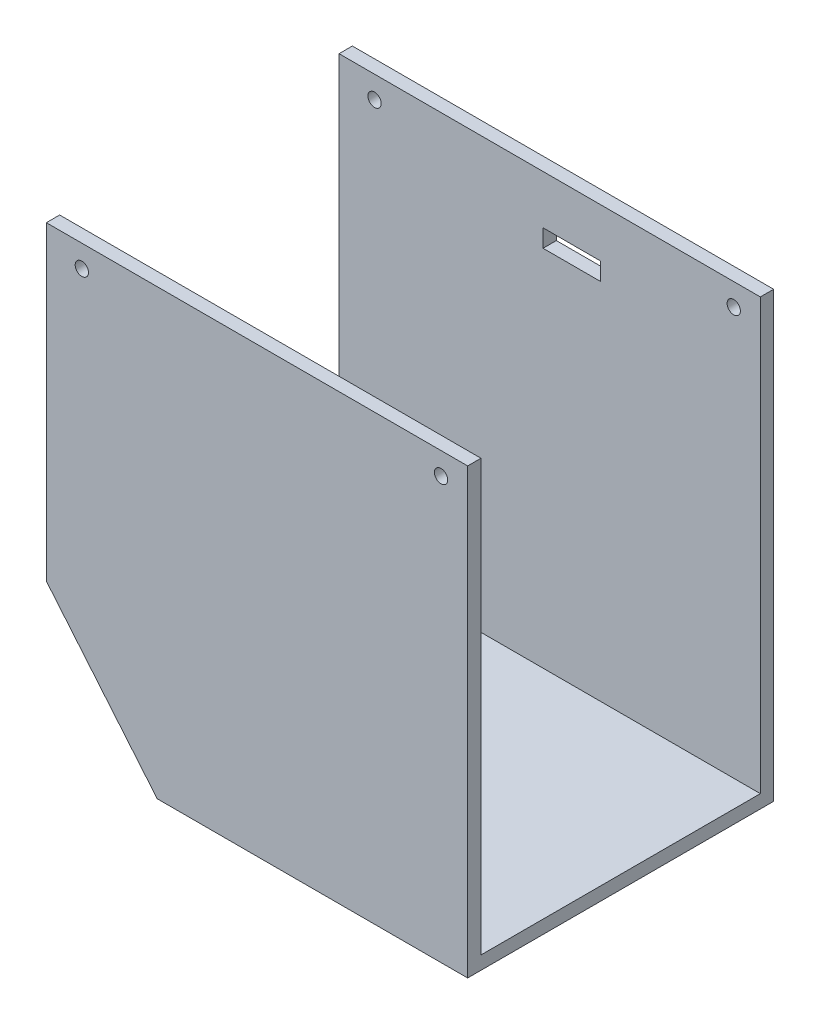
ISO-10303-21;
HEADER;
FILE_DESCRIPTION(('STEP AP214'),'2;1');
FILE_NAME('part.step','',(''),(''),'','','');
FILE_SCHEMA(('AUTOMOTIVE_DESIGN { 1 0 10303 214 1 1 1 1 }'));
ENDSEC;
DATA;
#1=APPLICATION_CONTEXT('core data for automotive mechanical design processes');
#2=APPLICATION_PROTOCOL_DEFINITION('international standard','automotive_design',2000,#1);
#3=PRODUCT_CONTEXT('',#1,'mechanical');
#4=PRODUCT('Part','Part','',(#3));
#5=PRODUCT_RELATED_PRODUCT_CATEGORY('part','',(#4));
#6=PRODUCT_DEFINITION_FORMATION('','',#4);
#7=PRODUCT_DEFINITION_CONTEXT('part definition',#1,'design');
#8=PRODUCT_DEFINITION('design','',#6,#7);
#9=PRODUCT_DEFINITION_SHAPE('','',#8);
#10=(LENGTH_UNIT() NAMED_UNIT(*) SI_UNIT(.MILLI.,.METRE.));
#11=(NAMED_UNIT(*) PLANE_ANGLE_UNIT() SI_UNIT($,.RADIAN.));
#12=(NAMED_UNIT(*) SI_UNIT($,.STERADIAN.) SOLID_ANGLE_UNIT());
#13=UNCERTAINTY_MEASURE_WITH_UNIT(LENGTH_MEASURE(1.E-05),#10,'distance_accuracy_value','');
#14=(GEOMETRIC_REPRESENTATION_CONTEXT(3) GLOBAL_UNCERTAINTY_ASSIGNED_CONTEXT((#13)) GLOBAL_UNIT_ASSIGNED_CONTEXT((#10,
#11,#12)) REPRESENTATION_CONTEXT('',''));
#15=CARTESIAN_POINT('',(0.,0.,0.));
#16=DIRECTION('',(0.,0.,1.));
#17=DIRECTION('',(1.,0.,0.));
#18=AXIS2_PLACEMENT_3D('',#15,#16,#17);
#19=CARTESIAN_POINT('',(-42.6208459214501,-3.,-43.6714501510574));
#20=DIRECTION('',(-1.,0.,0.));
#21=DIRECTION('',(0.,0.,1.));
#22=AXIS2_PLACEMENT_3D('',#19,#20,#21);
#23=PLANE('',#22);
#24=DIRECTION('',(0.,0.,-1.));
#25=VECTOR('',#24,1.);
#26=CARTESIAN_POINT('',(-42.6208459214501,27.,25.3285498489426));
#27=LINE('',#26,#25);
#28=CARTESIAN_POINT('',(-42.6208459214501,27.,25.3285498489426));
#29=VERTEX_POINT('',#28);
#30=CARTESIAN_POINT('',(-42.6208459214501,27.,22.3285498489426));
#31=VERTEX_POINT('',#30);
#32=EDGE_CURVE('E222',#29,#31,#27,.T.);
#33=ORIENTED_EDGE('',*,*,#32,.F.);
#34=DIRECTION('',(0.,1.,0.));
#35=VECTOR('',#34,1.);
#36=CARTESIAN_POINT('',(-42.6208459214501,-3.,25.3285498489426));
#37=LINE('',#36,#35);
#38=CARTESIAN_POINT('',(-42.6208459214501,97.,25.3285498489426));
#39=VERTEX_POINT('',#38);
#40=EDGE_CURVE('E350',#29,#39,#37,.T.);
#41=ORIENTED_EDGE('',*,*,#40,.T.);
#42=DIRECTION('',(0.,0.,-1.));
#43=VECTOR('',#42,1.);
#44=CARTESIAN_POINT('',(-42.6208459214501,97.,56.3285498489426));
#45=LINE('',#44,#43);
#46=CARTESIAN_POINT('',(-42.6208459214501,97.,22.3285498489426));
#47=VERTEX_POINT('',#46);
#48=EDGE_CURVE('E317',#39,#47,#45,.T.);
#49=ORIENTED_EDGE('',*,*,#48,.T.);
#50=DIRECTION('',(0.,-1.,0.));
#51=VECTOR('',#50,1.);
#52=CARTESIAN_POINT('',(-42.6208459214501,100.,22.3285498489426));
#53=LINE('',#52,#51);
#54=EDGE_CURVE('E336',#47,#31,#53,.T.);
#55=ORIENTED_EDGE('',*,*,#54,.T.);
#56=EDGE_LOOP('',(#33,#41,#49,#55));
#57=FACE_BOUND('',#56,.T.);
#58=ADVANCED_FACE('F35',(#57),#23,.T.);
#59=CARTESIAN_POINT('',(0.,0.,0.));
#60=DIRECTION('',(0.,1.,0.));
#61=DIRECTION('',(0.,0.,1.));
#62=AXIS2_PLACEMENT_3D('',#59,#60,#61);
#63=PLANE('',#62);
#64=DIRECTION('',(0.,0.,-1.));
#65=VECTOR('',#64,1.);
#66=CARTESIAN_POINT('',(-20.1208459214502,0.,0.));
#67=LINE('',#66,#65);
#68=CARTESIAN_POINT('',(-20.1208459214502,0.,22.3285498489426));
#69=VERTEX_POINT('',#68);
#70=CARTESIAN_POINT('',(-20.1208459214501,0.,-40.6714501510574));
#71=VERTEX_POINT('',#70);
#72=EDGE_CURVE('E221',#69,#71,#67,.T.);
#73=ORIENTED_EDGE('',*,*,#72,.F.);
#74=DIRECTION('',(-1.,0.,0.));
#75=VECTOR('',#74,1.);
#76=CARTESIAN_POINT('',(-42.6208459214501,0.,22.3285498489426));
#77=LINE('',#76,#75);
#78=CARTESIAN_POINT('',(52.3791540785498,0.,22.3285498489426));
#79=VERTEX_POINT('',#78);
#80=EDGE_CURVE('E333',#79,#69,#77,.T.);
#81=ORIENTED_EDGE('',*,*,#80,.F.);
#82=DIRECTION('',(0.,0.,-1.));
#83=VECTOR('',#82,1.);
#84=CARTESIAN_POINT('',(52.3791540785498,0.,-43.6714501510574));
#85=LINE('',#84,#83);
#86=CARTESIAN_POINT('',(52.3791540785498,0.,-40.6714501510574));
#87=VERTEX_POINT('',#86);
#88=EDGE_CURVE('E341',#79,#87,#85,.T.);
#89=ORIENTED_EDGE('',*,*,#88,.T.);
#90=DIRECTION('',(1.,0.,0.));
#91=VECTOR('',#90,1.);
#92=CARTESIAN_POINT('',(-42.6208459214501,0.,-40.6714501510574));
#93=LINE('',#92,#91);
#94=EDGE_CURVE('E325',#71,#87,#93,.T.);
#95=ORIENTED_EDGE('',*,*,#94,.F.);
#96=EDGE_LOOP('',(#73,#81,#89,#95));
#97=FACE_BOUND('',#96,.T.);
#98=ADVANCED_FACE('F395',(#97),#63,.T.);
#99=CARTESIAN_POINT('',(-42.6208459214501,27.,-40.6714501510574));
#100=VERTEX_POINT('',#99);
#101=CARTESIAN_POINT('',(-42.6208459214501,27.,-43.6714501510574));
#102=VERTEX_POINT('',#101);
#103=EDGE_CURVE('E216',#100,#102,#27,.T.);
#104=ORIENTED_EDGE('',*,*,#103,.F.);
#105=DIRECTION('',(0.,-1.,0.));
#106=VECTOR('',#105,1.);
#107=CARTESIAN_POINT('',(-42.6208459214501,100.,-40.6714501510574));
#108=LINE('',#107,#106);
#109=CARTESIAN_POINT('',(-42.6208459214501,97.,-40.6714501510574));
#110=VERTEX_POINT('',#109);
#111=EDGE_CURVE('E330',#110,#100,#108,.T.);
#112=ORIENTED_EDGE('',*,*,#111,.F.);
#113=CARTESIAN_POINT('',(-42.6208459214501,97.,-43.6714501510574));
#114=VERTEX_POINT('',#113);
#115=EDGE_CURVE('E314',#110,#114,#45,.T.);
#116=ORIENTED_EDGE('',*,*,#115,.T.);
#117=DIRECTION('',(0.,1.,0.));
#118=VECTOR('',#117,1.);
#119=CARTESIAN_POINT('',(-42.6208459214501,-3.,-43.6714501510574));
#120=LINE('',#119,#118);
#121=EDGE_CURVE('E353',#102,#114,#120,.T.);
#122=ORIENTED_EDGE('',*,*,#121,.F.);
#123=EDGE_LOOP('',(#104,#112,#116,#122));
#124=FACE_BOUND('',#123,.T.);
#125=ADVANCED_FACE('F37',(#124),#23,.T.);
#126=CARTESIAN_POINT('',(-42.6208459214501,-3.,-43.6714501510574));
#127=DIRECTION('',(0.,0.,-1.));
#128=DIRECTION('',(-1.,0.,0.));
#129=AXIS2_PLACEMENT_3D('',#126,#127,#128);
#130=PLANE('',#129);
#131=DIRECTION('',(1.,0.,0.));
#132=VECTOR('',#131,1.);
#133=CARTESIAN_POINT('',(0.,86.,-43.6714501510574));
#134=LINE('',#133,#132);
#135=CARTESIAN_POINT('',(3.37915407854984,86.,-43.6714501510574));
#136=VERTEX_POINT('',#135);
#137=CARTESIAN_POINT('',(16.3791540785498,86.,-43.6714501510574));
#138=VERTEX_POINT('',#137);
#139=EDGE_CURVE('E50',#136,#138,#134,.T.);
#140=ORIENTED_EDGE('',*,*,#139,.F.);
#141=DIRECTION('',(0.,-1.,0.));
#142=VECTOR('',#141,1.);
#143=CARTESIAN_POINT('',(3.37915407854984,0.,-43.6714501510574));
#144=LINE('',#143,#142);
#145=CARTESIAN_POINT('',(3.37915407854984,82.,-43.6714501510574));
#146=VERTEX_POINT('',#145);
#147=EDGE_CURVE('E203',#136,#146,#144,.T.);
#148=ORIENTED_EDGE('',*,*,#147,.T.);
#149=DIRECTION('',(1.,0.,0.));
#150=VECTOR('',#149,1.);
#151=CARTESIAN_POINT('',(0.,82.,-43.6714501510574));
#152=LINE('',#151,#150);
#153=CARTESIAN_POINT('',(16.3791540785498,82.,-43.6714501510574));
#154=VERTEX_POINT('',#153);
#155=EDGE_CURVE('E187',#146,#154,#152,.T.);
#156=ORIENTED_EDGE('',*,*,#155,.T.);
#157=DIRECTION('',(0.,-1.,0.));
#158=VECTOR('',#157,1.);
#159=CARTESIAN_POINT('',(16.3791540785498,0.,-43.6714501510574));
#160=LINE('',#159,#158);
#161=EDGE_CURVE('E196',#138,#154,#160,.T.);
#162=ORIENTED_EDGE('',*,*,#161,.F.);
#163=EDGE_LOOP('',(#140,#148,#156,#162));
#164=FACE_BOUND('',#163,.T.);
#165=DIRECTION('',(0.64018439966448,-0.768221279597376,0.));
#166=VECTOR('',#165,1.);
#167=CARTESIAN_POINT('',(-17.6208459214501,-3.,-43.6714501510574));
#168=LINE('',#167,#166);
#169=CARTESIAN_POINT('',(-17.6208459214501,-3.,-43.6714501510574));
#170=VERTEX_POINT('',#169);
#171=EDGE_CURVE('E210',#102,#170,#168,.T.);
#172=ORIENTED_EDGE('',*,*,#171,.F.);
#173=ORIENTED_EDGE('',*,*,#121,.T.);
#174=DIRECTION('',(-1.,0.,0.));
#175=VECTOR('',#174,1.);
#176=CARTESIAN_POINT('',(-42.6208459214501,97.,-43.6714501510574));
#177=LINE('',#176,#175);
#178=CARTESIAN_POINT('',(52.3791540785498,97.,-43.6714501510574));
#179=VERTEX_POINT('',#178);
#180=EDGE_CURVE('E304',#179,#114,#177,.T.);
#181=ORIENTED_EDGE('',*,*,#180,.F.);
#182=DIRECTION('',(0.,1.,0.));
#183=VECTOR('',#182,1.);
#184=CARTESIAN_POINT('',(52.3791540785498,-3.,-43.6714501510574));
#185=LINE('',#184,#183);
#186=CARTESIAN_POINT('',(52.3791540785498,-3.,-43.6714501510574));
#187=VERTEX_POINT('',#186);
#188=EDGE_CURVE('E356',#187,#179,#185,.T.);
#189=ORIENTED_EDGE('',*,*,#188,.F.);
#190=DIRECTION('',(-1.,0.,0.));
#191=VECTOR('',#190,1.);
#192=CARTESIAN_POINT('',(-42.6208459214501,-3.,-43.6714501510574));
#193=LINE('',#192,#191);
#194=EDGE_CURVE('E347',#187,#170,#193,.T.);
#195=ORIENTED_EDGE('',*,*,#194,.T.);
#196=EDGE_LOOP('',(#172,#173,#181,#189,#195));
#197=FACE_BOUND('',#196,.T.);
#198=CARTESIAN_POINT('',(-34.6208459214502,92.,-43.6714501510574));
#199=DIRECTION('',(0.,0.,-1.));
#200=DIRECTION('',(-1.,0.,0.));
#201=AXIS2_PLACEMENT_3D('',#198,#199,#200);
#202=CIRCLE('',#201,1.5);
#203=CARTESIAN_POINT('',(-36.1208459214502,92.,-43.6714501510574));
#204=VERTEX_POINT('',#203);
#205=EDGE_CURVE('E233',#204,#204,#202,.T.);
#206=ORIENTED_EDGE('',*,*,#205,.F.);
#207=EDGE_LOOP('',(#206));
#208=FACE_BOUND('',#207,.T.);
#209=CARTESIAN_POINT('',(46.3791540785499,92.,-43.6714501510574));
#210=DIRECTION('',(0.,0.,-1.));
#211=DIRECTION('',(-1.,0.,0.));
#212=AXIS2_PLACEMENT_3D('',#209,#210,#211);
#213=CIRCLE('',#212,1.5);
#214=CARTESIAN_POINT('',(44.8791540785499,92.,-43.6714501510574));
#215=VERTEX_POINT('',#214);
#216=EDGE_CURVE('E228',#215,#215,#213,.T.);
#217=ORIENTED_EDGE('',*,*,#216,.F.);
#218=EDGE_LOOP('',(#217));
#219=FACE_BOUND('',#218,.T.);
#220=DIRECTION('',(1.,0.,0.));
#221=VECTOR('',#220,1.);
#222=CARTESIAN_POINT('',(-2.62084592145016,38.,-43.6714501510574));
#223=LINE('',#222,#221);
#224=CARTESIAN_POINT('',(-2.62084592145016,38.,-43.6714501510574));
#225=VERTEX_POINT('',#224);
#226=CARTESIAN_POINT('',(22.3791540785498,38.,-43.6714501510574));
#227=VERTEX_POINT('',#226);
#228=EDGE_CURVE('E274',#225,#227,#223,.T.);
#229=ORIENTED_EDGE('',*,*,#228,.F.);
#230=DIRECTION('',(0.,1.,0.));
#231=VECTOR('',#230,1.);
#232=CARTESIAN_POINT('',(-2.62084592145016,2.,-43.6714501510574));
#233=LINE('',#232,#231);
#234=CARTESIAN_POINT('',(-2.62084592145016,2.,-43.6714501510574));
#235=VERTEX_POINT('',#234);
#236=EDGE_CURVE('E285',#235,#225,#233,.T.);
#237=ORIENTED_EDGE('',*,*,#236,.F.);
#238=DIRECTION('',(1.,0.,0.));
#239=VECTOR('',#238,1.);
#240=CARTESIAN_POINT('',(-2.62084592145016,2.,-43.6714501510574));
#241=LINE('',#240,#239);
#242=CARTESIAN_POINT('',(22.3791540785498,2.,-43.6714501510574));
#243=VERTEX_POINT('',#242);
#244=EDGE_CURVE('E297',#235,#243,#241,.T.);
#245=ORIENTED_EDGE('',*,*,#244,.T.);
#246=DIRECTION('',(0.,1.,0.));
#247=VECTOR('',#246,1.);
#248=CARTESIAN_POINT('',(22.3791540785498,2.,-43.6714501510574));
#249=LINE('',#248,#247);
#250=EDGE_CURVE('E294',#243,#227,#249,.T.);
#251=ORIENTED_EDGE('',*,*,#250,.T.);
#252=EDGE_LOOP('',(#229,#237,#245,#251));
#253=FACE_BOUND('',#252,.T.);
#254=ADVANCED_FACE('F200',(#164,#197,#208,#219,#253),#130,.T.);
#255=CARTESIAN_POINT('',(52.3791540785498,-3.,-43.6714501510574));
#256=DIRECTION('',(1.,0.,0.));
#257=DIRECTION('',(0.,0.,-1.));
#258=AXIS2_PLACEMENT_3D('',#255,#256,#257);
#259=PLANE('',#258);
#260=DIRECTION('',(0.,0.,-1.));
#261=VECTOR('',#260,1.);
#262=CARTESIAN_POINT('',(52.3791540785498,97.,56.3285498489426));
#263=LINE('',#262,#261);
#264=CARTESIAN_POINT('',(52.3791540785498,97.,25.3285498489426));
#265=VERTEX_POINT('',#264);
#266=CARTESIAN_POINT('',(52.3791540785498,97.,22.3285498489426));
#267=VERTEX_POINT('',#266);
#268=EDGE_CURVE('E318',#265,#267,#263,.T.);
#269=ORIENTED_EDGE('',*,*,#268,.F.);
#270=DIRECTION('',(0.,1.,0.));
#271=VECTOR('',#270,1.);
#272=CARTESIAN_POINT('',(52.3791540785498,-3.,25.3285498489426));
#273=LINE('',#272,#271);
#274=CARTESIAN_POINT('',(52.3791540785498,-3.,25.3285498489426));
#275=VERTEX_POINT('',#274);
#276=EDGE_CURVE('E359',#275,#265,#273,.T.);
#277=ORIENTED_EDGE('',*,*,#276,.F.);
#278=DIRECTION('',(0.,0.,-1.));
#279=VECTOR('',#278,1.);
#280=CARTESIAN_POINT('',(52.3791540785498,-3.,-43.6714501510574));
#281=LINE('',#280,#279);
#282=EDGE_CURVE('E344',#275,#187,#281,.T.);
#283=ORIENTED_EDGE('',*,*,#282,.T.);
#284=ORIENTED_EDGE('',*,*,#188,.T.);
#285=CARTESIAN_POINT('',(52.3791540785498,97.,-40.6714501510574));
#286=VERTEX_POINT('',#285);
#287=EDGE_CURVE('E313',#286,#179,#263,.T.);
#288=ORIENTED_EDGE('',*,*,#287,.F.);
#289=DIRECTION('',(0.,-1.,0.));
#290=VECTOR('',#289,1.);
#291=CARTESIAN_POINT('',(52.3791540785498,100.,-40.6714501510574));
#292=LINE('',#291,#290);
#293=EDGE_CURVE('E327',#286,#87,#292,.T.);
#294=ORIENTED_EDGE('',*,*,#293,.T.);
#295=ORIENTED_EDGE('',*,*,#88,.F.);
#296=DIRECTION('',(0.,-1.,0.));
#297=VECTOR('',#296,1.);
#298=CARTESIAN_POINT('',(52.3791540785498,100.,22.3285498489426));
#299=LINE('',#298,#297);
#300=EDGE_CURVE('E339',#267,#79,#299,.T.);
#301=ORIENTED_EDGE('',*,*,#300,.F.);
#302=EDGE_LOOP('',(#269,#277,#283,#284,#288,#294,#295,#301));
#303=FACE_BOUND('',#302,.T.);
#304=ADVANCED_FACE('F408',(#303),#259,.T.);
#305=CARTESIAN_POINT('',(-42.6208459214501,-3.,25.3285498489426));
#306=DIRECTION('',(0.,0.,1.));
#307=DIRECTION('',(1.,0.,0.));
#308=AXIS2_PLACEMENT_3D('',#305,#306,#307);
#309=PLANE('',#308);
#310=DIRECTION('',(0.64018439966448,-0.768221279597376,0.));
#311=VECTOR('',#310,1.);
#312=CARTESIAN_POINT('',(-17.6208459214501,-3.,25.3285498489426));
#313=LINE('',#312,#311);
#314=CARTESIAN_POINT('',(-17.6208459214501,-3.,25.3285498489426));
#315=VERTEX_POINT('',#314);
#316=EDGE_CURVE('E213',#29,#315,#313,.T.);
#317=ORIENTED_EDGE('',*,*,#316,.T.);
#318=DIRECTION('',(1.,0.,0.));
#319=VECTOR('',#318,1.);
#320=CARTESIAN_POINT('',(-42.6208459214501,-3.,25.3285498489426));
#321=LINE('',#320,#319);
#322=EDGE_CURVE('E342',#315,#275,#321,.T.);
#323=ORIENTED_EDGE('',*,*,#322,.T.);
#324=ORIENTED_EDGE('',*,*,#276,.T.);
#325=DIRECTION('',(1.,0.,0.));
#326=VECTOR('',#325,1.);
#327=CARTESIAN_POINT('',(-42.6208459214501,97.,25.3285498489426));
#328=LINE('',#327,#326);
#329=EDGE_CURVE('E323',#39,#265,#328,.T.);
#330=ORIENTED_EDGE('',*,*,#329,.F.);
#331=ORIENTED_EDGE('',*,*,#40,.F.);
#332=EDGE_LOOP('',(#317,#323,#324,#330,#331));
#333=FACE_BOUND('',#332,.T.);
#334=CARTESIAN_POINT('',(-34.6208459214502,92.,25.3285498489426));
#335=DIRECTION('',(0.,0.,-1.));
#336=DIRECTION('',(-1.,0.,0.));
#337=AXIS2_PLACEMENT_3D('',#334,#335,#336);
#338=CIRCLE('',#337,1.5);
#339=CARTESIAN_POINT('',(-36.1208459214502,92.,25.3285498489426));
#340=VERTEX_POINT('',#339);
#341=EDGE_CURVE('E229',#340,#340,#338,.T.);
#342=ORIENTED_EDGE('',*,*,#341,.T.);
#343=EDGE_LOOP('',(#342));
#344=FACE_BOUND('',#343,.T.);
#345=CARTESIAN_POINT('',(46.3791540785499,92.,25.3285498489426));
#346=DIRECTION('',(0.,0.,-1.));
#347=DIRECTION('',(-1.,0.,0.));
#348=AXIS2_PLACEMENT_3D('',#345,#346,#347);
#349=CIRCLE('',#348,1.5);
#350=CARTESIAN_POINT('',(44.8791540785499,92.,25.3285498489426));
#351=VERTEX_POINT('',#350);
#352=EDGE_CURVE('E236',#351,#351,#349,.T.);
#353=ORIENTED_EDGE('',*,*,#352,.T.);
#354=EDGE_LOOP('',(#353));
#355=FACE_BOUND('',#354,.T.);
#356=ADVANCED_FACE('F432',(#333,#344,#355),#309,.T.);
#357=CARTESIAN_POINT('',(0.,-3.,0.));
#358=DIRECTION('',(0.,1.,0.));
#359=DIRECTION('',(0.,0.,1.));
#360=AXIS2_PLACEMENT_3D('',#357,#358,#359);
#361=PLANE('',#360);
#362=DIRECTION('',(1.,0.,0.));
#363=VECTOR('',#362,1.);
#364=CARTESIAN_POINT('',(-7.62084592145015,-3.,-33.6714501510574));
#365=LINE('',#364,#363);
#366=CARTESIAN_POINT('',(-7.62084592145015,-3.,-33.6714501510574));
#367=VERTEX_POINT('',#366);
#368=CARTESIAN_POINT('',(22.3791540785498,-3.,-33.6714501510574));
#369=VERTEX_POINT('',#368);
#370=EDGE_CURVE('E264',#367,#369,#365,.T.);
#371=ORIENTED_EDGE('',*,*,#370,.F.);
#372=DIRECTION('',(0.,0.,-1.));
#373=VECTOR('',#372,1.);
#374=CARTESIAN_POINT('',(-7.62084592145015,-3.,-3.6714501510574));
#375=LINE('',#374,#373);
#376=CARTESIAN_POINT('',(-7.62084592145015,-3.,-3.6714501510574));
#377=VERTEX_POINT('',#376);
#378=EDGE_CURVE('E248',#377,#367,#375,.T.);
#379=ORIENTED_EDGE('',*,*,#378,.F.);
#380=DIRECTION('',(-1.,0.,0.));
#381=VECTOR('',#380,1.);
#382=CARTESIAN_POINT('',(-7.62084592145015,-3.,-3.6714501510574));
#383=LINE('',#382,#381);
#384=CARTESIAN_POINT('',(22.3791540785498,-3.,-3.6714501510574));
#385=VERTEX_POINT('',#384);
#386=EDGE_CURVE('E253',#385,#377,#383,.T.);
#387=ORIENTED_EDGE('',*,*,#386,.F.);
#388=DIRECTION('',(0.,0.,1.));
#389=VECTOR('',#388,1.);
#390=CARTESIAN_POINT('',(22.3791540785498,-3.,-3.6714501510574));
#391=LINE('',#390,#389);
#392=EDGE_CURVE('E267',#369,#385,#391,.T.);
#393=ORIENTED_EDGE('',*,*,#392,.F.);
#394=EDGE_LOOP('',(#371,#379,#387,#393));
#395=FACE_BOUND('',#394,.T.);
#396=ORIENTED_EDGE('',*,*,#322,.F.);
#397=DIRECTION('',(0.,0.,-1.));
#398=VECTOR('',#397,1.);
#399=CARTESIAN_POINT('',(-17.6208459214501,-3.,25.3285498489426));
#400=LINE('',#399,#398);
#401=EDGE_CURVE('E218',#315,#170,#400,.T.);
#402=ORIENTED_EDGE('',*,*,#401,.T.);
#403=ORIENTED_EDGE('',*,*,#194,.F.);
#404=ORIENTED_EDGE('',*,*,#282,.F.);
#405=EDGE_LOOP('',(#396,#402,#403,#404));
#406=FACE_BOUND('',#405,.T.);
#407=ADVANCED_FACE('F430',(#395,#406),#361,.F.);
#408=CARTESIAN_POINT('',(-42.6208459214501,100.,22.3285498489426));
#409=DIRECTION('',(0.,0.,1.));
#410=DIRECTION('',(1.,0.,0.));
#411=AXIS2_PLACEMENT_3D('',#408,#409,#410);
#412=PLANE('',#411);
#413=CARTESIAN_POINT('',(-34.6208459214502,92.,22.3285498489426));
#414=DIRECTION('',(0.,0.,1.));
#415=DIRECTION('',(1.,0.,0.));
#416=AXIS2_PLACEMENT_3D('',#413,#414,#415);
#417=CIRCLE('',#416,1.5);
#418=CARTESIAN_POINT('',(-33.1208459214502,92.,22.3285498489426));
#419=VERTEX_POINT('',#418);
#420=EDGE_CURVE('E245',#419,#419,#417,.T.);
#421=ORIENTED_EDGE('',*,*,#420,.T.);
#422=EDGE_LOOP('',(#421));
#423=FACE_BOUND('',#422,.T.);
#424=CARTESIAN_POINT('',(46.3791540785499,92.,22.3285498489426));
#425=DIRECTION('',(0.,0.,1.));
#426=DIRECTION('',(1.,0.,0.));
#427=AXIS2_PLACEMENT_3D('',#424,#425,#426);
#428=CIRCLE('',#427,1.5);
#429=CARTESIAN_POINT('',(47.8791540785499,92.,22.3285498489426));
#430=VERTEX_POINT('',#429);
#431=EDGE_CURVE('E241',#430,#430,#428,.T.);
#432=ORIENTED_EDGE('',*,*,#431,.T.);
#433=EDGE_LOOP('',(#432));
#434=FACE_BOUND('',#433,.T.);
#435=ORIENTED_EDGE('',*,*,#80,.T.);
#436=DIRECTION('',(-0.64018439966448,0.768221279597376,0.));
#437=VECTOR('',#436,1.);
#438=CARTESIAN_POINT('',(-78.5224852657125,70.0819672131148,22.3285498489426));
#439=LINE('',#438,#437);
#440=EDGE_CURVE('E225',#69,#31,#439,.T.);
#441=ORIENTED_EDGE('',*,*,#440,.T.);
#442=ORIENTED_EDGE('',*,*,#54,.F.);
#443=DIRECTION('',(1.,0.,0.));
#444=VECTOR('',#443,1.);
#445=CARTESIAN_POINT('',(-42.6208459214501,97.,22.3285498489426));
#446=LINE('',#445,#444);
#447=EDGE_CURVE('E320',#47,#267,#446,.T.);
#448=ORIENTED_EDGE('',*,*,#447,.T.);
#449=ORIENTED_EDGE('',*,*,#300,.T.);
#450=EDGE_LOOP('',(#435,#441,#442,#448,#449));
#451=FACE_BOUND('',#450,.T.);
#452=ADVANCED_FACE('F443',(#423,#434,#451),#412,.F.);
#453=CARTESIAN_POINT('',(-42.6208459214501,100.,-40.6714501510574));
#454=DIRECTION('',(0.,0.,-1.));
#455=DIRECTION('',(-1.,0.,0.));
#456=AXIS2_PLACEMENT_3D('',#453,#454,#455);
#457=PLANE('',#456);
#458=DIRECTION('',(0.,-1.,0.));
#459=VECTOR('',#458,1.);
#460=CARTESIAN_POINT('',(3.37915407854984,100.,-40.6714501510574));
#461=LINE('',#460,#459);
#462=CARTESIAN_POINT('',(3.37915407854984,86.,-40.6714501510574));
#463=VERTEX_POINT('',#462);
#464=CARTESIAN_POINT('',(3.37915407854984,82.,-40.6714501510574));
#465=VERTEX_POINT('',#464);
#466=EDGE_CURVE('E43',#463,#465,#461,.T.);
#467=ORIENTED_EDGE('',*,*,#466,.F.);
#468=DIRECTION('',(1.,0.,0.));
#469=VECTOR('',#468,1.);
#470=CARTESIAN_POINT('',(-42.6208459214501,86.,-40.6714501510574));
#471=LINE('',#470,#469);
#472=CARTESIAN_POINT('',(16.3791540785498,86.,-40.6714501510574));
#473=VERTEX_POINT('',#472);
#474=EDGE_CURVE('E11',#463,#473,#471,.T.);
#475=ORIENTED_EDGE('',*,*,#474,.T.);
#476=DIRECTION('',(0.,-1.,0.));
#477=VECTOR('',#476,1.);
#478=CARTESIAN_POINT('',(16.3791540785498,100.,-40.6714501510574));
#479=LINE('',#478,#477);
#480=CARTESIAN_POINT('',(16.3791540785498,82.,-40.6714501510574));
#481=VERTEX_POINT('',#480);
#482=EDGE_CURVE('E372',#473,#481,#479,.T.);
#483=ORIENTED_EDGE('',*,*,#482,.T.);
#484=DIRECTION('',(1.,0.,0.));
#485=VECTOR('',#484,1.);
#486=CARTESIAN_POINT('',(-42.6208459214501,82.,-40.6714501510574));
#487=LINE('',#486,#485);
#488=EDGE_CURVE('E190',#465,#481,#487,.T.);
#489=ORIENTED_EDGE('',*,*,#488,.F.);
#490=EDGE_LOOP('',(#467,#475,#483,#489));
#491=FACE_BOUND('',#490,.T.);
#492=CARTESIAN_POINT('',(-34.6208459214502,92.,-40.6714501510574));
#493=DIRECTION('',(0.,0.,-1.));
#494=DIRECTION('',(-1.,0.,0.));
#495=AXIS2_PLACEMENT_3D('',#492,#493,#494);
#496=CIRCLE('',#495,1.5);
#497=CARTESIAN_POINT('',(-36.1208459214502,92.,-40.6714501510574));
#498=VERTEX_POINT('',#497);
#499=EDGE_CURVE('E244',#498,#498,#496,.T.);
#500=ORIENTED_EDGE('',*,*,#499,.T.);
#501=EDGE_LOOP('',(#500));
#502=FACE_BOUND('',#501,.T.);
#503=CARTESIAN_POINT('',(46.3791540785499,92.,-40.6714501510574));
#504=DIRECTION('',(0.,0.,-1.));
#505=DIRECTION('',(-1.,0.,0.));
#506=AXIS2_PLACEMENT_3D('',#503,#504,#505);
#507=CIRCLE('',#506,1.5);
#508=CARTESIAN_POINT('',(44.8791540785499,92.,-40.6714501510574));
#509=VERTEX_POINT('',#508);
#510=EDGE_CURVE('E232',#509,#509,#507,.T.);
#511=ORIENTED_EDGE('',*,*,#510,.T.);
#512=EDGE_LOOP('',(#511));
#513=FACE_BOUND('',#512,.T.);
#514=ORIENTED_EDGE('',*,*,#111,.T.);
#515=DIRECTION('',(0.64018439966448,-0.768221279597376,0.));
#516=VECTOR('',#515,1.);
#517=CARTESIAN_POINT('',(-78.5224852657125,70.0819672131148,-40.6714501510574));
#518=LINE('',#517,#516);
#519=EDGE_CURVE('E365',#100,#71,#518,.T.);
#520=ORIENTED_EDGE('',*,*,#519,.T.);
#521=ORIENTED_EDGE('',*,*,#94,.T.);
#522=ORIENTED_EDGE('',*,*,#293,.F.);
#523=DIRECTION('',(-1.,0.,0.));
#524=VECTOR('',#523,1.);
#525=CARTESIAN_POINT('',(-42.6208459214501,97.,-40.6714501510574));
#526=LINE('',#525,#524);
#527=EDGE_CURVE('E355',#286,#110,#526,.T.);
#528=ORIENTED_EDGE('',*,*,#527,.T.);
#529=EDGE_LOOP('',(#514,#520,#521,#522,#528));
#530=FACE_BOUND('',#529,.T.);
#531=ADVANCED_FACE('F379',(#491,#502,#513,#530),#457,.F.);
#532=CARTESIAN_POINT('',(-42.6208459214501,97.,56.3285498489426));
#533=DIRECTION('',(0.,-1.,0.));
#534=DIRECTION('',(1.,0.,0.));
#535=AXIS2_PLACEMENT_3D('',#532,#533,#534);
#536=PLANE('',#535);
#537=ORIENTED_EDGE('',*,*,#287,.T.);
#538=ORIENTED_EDGE('',*,*,#180,.T.);
#539=ORIENTED_EDGE('',*,*,#115,.F.);
#540=ORIENTED_EDGE('',*,*,#527,.F.);
#541=EDGE_LOOP('',(#537,#538,#539,#540));
#542=FACE_BOUND('',#541,.T.);
#543=ADVANCED_FACE('F419',(#542),#536,.F.);
#544=ORIENTED_EDGE('',*,*,#329,.T.);
#545=ORIENTED_EDGE('',*,*,#268,.T.);
#546=ORIENTED_EDGE('',*,*,#447,.F.);
#547=ORIENTED_EDGE('',*,*,#48,.F.);
#548=EDGE_LOOP('',(#544,#545,#546,#547));
#549=FACE_BOUND('',#548,.T.);
#550=ADVANCED_FACE('F438',(#549),#536,.F.);
#551=CARTESIAN_POINT('',(-2.62084592145016,38.,-42.1714501510574));
#552=DIRECTION('',(0.,1.,0.));
#553=DIRECTION('',(-1.,0.,0.));
#554=AXIS2_PLACEMENT_3D('',#551,#552,#553);
#555=PLANE('',#554);
#556=ORIENTED_EDGE('',*,*,#228,.T.);
#557=DIRECTION('',(0.,0.,-1.));
#558=VECTOR('',#557,1.);
#559=CARTESIAN_POINT('',(22.3791540785498,38.,-42.1714501510574));
#560=LINE('',#559,#558);
#561=CARTESIAN_POINT('',(22.3791540785498,38.,-42.1714501510574));
#562=VERTEX_POINT('',#561);
#563=EDGE_CURVE('E292',#562,#227,#560,.T.);
#564=ORIENTED_EDGE('',*,*,#563,.F.);
#565=DIRECTION('',(1.,0.,0.));
#566=VECTOR('',#565,1.);
#567=CARTESIAN_POINT('',(-2.62084592145016,38.,-42.1714501510574));
#568=LINE('',#567,#566);
#569=CARTESIAN_POINT('',(-2.62084592145016,38.,-42.1714501510574));
#570=VERTEX_POINT('',#569);
#571=EDGE_CURVE('E281',#570,#562,#568,.T.);
#572=ORIENTED_EDGE('',*,*,#571,.F.);
#573=DIRECTION('',(0.,0.,-1.));
#574=VECTOR('',#573,1.);
#575=CARTESIAN_POINT('',(-2.62084592145016,38.,-42.1714501510574));
#576=LINE('',#575,#574);
#577=EDGE_CURVE('E302',#570,#225,#576,.T.);
#578=ORIENTED_EDGE('',*,*,#577,.T.);
#579=EDGE_LOOP('',(#556,#564,#572,#578));
#580=FACE_BOUND('',#579,.T.);
#581=ADVANCED_FACE('F537',(#580),#555,.F.);
#582=CARTESIAN_POINT('',(-2.62084592145016,2.,-42.1714501510574));
#583=DIRECTION('',(-1.,0.,0.));
#584=DIRECTION('',(0.,0.,1.));
#585=AXIS2_PLACEMENT_3D('',#582,#583,#584);
#586=PLANE('',#585);
#587=ORIENTED_EDGE('',*,*,#236,.T.);
#588=ORIENTED_EDGE('',*,*,#577,.F.);
#589=DIRECTION('',(0.,1.,0.));
#590=VECTOR('',#589,1.);
#591=CARTESIAN_POINT('',(-2.62084592145016,2.,-42.1714501510574));
#592=LINE('',#591,#590);
#593=CARTESIAN_POINT('',(-2.62084592145016,2.,-42.1714501510574));
#594=VERTEX_POINT('',#593);
#595=EDGE_CURVE('E289',#594,#570,#592,.T.);
#596=ORIENTED_EDGE('',*,*,#595,.F.);
#597=DIRECTION('',(0.,0.,-1.));
#598=VECTOR('',#597,1.);
#599=CARTESIAN_POINT('',(-2.62084592145016,2.,-42.1714501510574));
#600=LINE('',#599,#598);
#601=EDGE_CURVE('E305',#594,#235,#600,.T.);
#602=ORIENTED_EDGE('',*,*,#601,.T.);
#603=EDGE_LOOP('',(#587,#588,#596,#602));
#604=FACE_BOUND('',#603,.T.);
#605=ADVANCED_FACE('F543',(#604),#586,.F.);
#606=CARTESIAN_POINT('',(-2.62084592145016,2.,-42.1714501510574));
#607=DIRECTION('',(0.,1.,0.));
#608=DIRECTION('',(-1.,0.,0.));
#609=AXIS2_PLACEMENT_3D('',#606,#607,#608);
#610=PLANE('',#609);
#611=ORIENTED_EDGE('',*,*,#244,.F.);
#612=ORIENTED_EDGE('',*,*,#601,.F.);
#613=DIRECTION('',(1.,0.,0.));
#614=VECTOR('',#613,1.);
#615=CARTESIAN_POINT('',(-2.62084592145016,2.,-42.1714501510574));
#616=LINE('',#615,#614);
#617=CARTESIAN_POINT('',(22.3791540785498,2.,-42.1714501510574));
#618=VERTEX_POINT('',#617);
#619=EDGE_CURVE('E287',#594,#618,#616,.T.);
#620=ORIENTED_EDGE('',*,*,#619,.T.);
#621=DIRECTION('',(0.,0.,-1.));
#622=VECTOR('',#621,1.);
#623=CARTESIAN_POINT('',(22.3791540785498,2.,-42.1714501510574));
#624=LINE('',#623,#622);
#625=EDGE_CURVE('E307',#618,#243,#624,.T.);
#626=ORIENTED_EDGE('',*,*,#625,.T.);
#627=EDGE_LOOP('',(#611,#612,#620,#626));
#628=FACE_BOUND('',#627,.T.);
#629=ADVANCED_FACE('F551',(#628),#610,.T.);
#630=CARTESIAN_POINT('',(22.3791540785498,2.,-42.1714501510574));
#631=DIRECTION('',(-1.,0.,0.));
#632=DIRECTION('',(0.,0.,1.));
#633=AXIS2_PLACEMENT_3D('',#630,#631,#632);
#634=PLANE('',#633);
#635=ORIENTED_EDGE('',*,*,#250,.F.);
#636=ORIENTED_EDGE('',*,*,#625,.F.);
#637=DIRECTION('',(0.,1.,0.));
#638=VECTOR('',#637,1.);
#639=CARTESIAN_POINT('',(22.3791540785498,2.,-42.1714501510574));
#640=LINE('',#639,#638);
#641=EDGE_CURVE('E284',#618,#562,#640,.T.);
#642=ORIENTED_EDGE('',*,*,#641,.T.);
#643=ORIENTED_EDGE('',*,*,#563,.T.);
#644=EDGE_LOOP('',(#635,#636,#642,#643));
#645=FACE_BOUND('',#644,.T.);
#646=ADVANCED_FACE('F559',(#645),#634,.T.);
#647=CARTESIAN_POINT('',(0.,0.,-42.1714501510574));
#648=DIRECTION('',(0.,0.,1.));
#649=DIRECTION('',(1.,0.,0.));
#650=AXIS2_PLACEMENT_3D('',#647,#648,#649);
#651=PLANE('',#650);
#652=ORIENTED_EDGE('',*,*,#571,.T.);
#653=ORIENTED_EDGE('',*,*,#641,.F.);
#654=ORIENTED_EDGE('',*,*,#619,.F.);
#655=ORIENTED_EDGE('',*,*,#595,.T.);
#656=EDGE_LOOP('',(#652,#653,#654,#655));
#657=FACE_BOUND('',#656,.T.);
#658=ADVANCED_FACE('F567',(#657),#651,.F.);
#659=CARTESIAN_POINT('',(-7.62084592145015,-1.5,-3.6714501510574));
#660=DIRECTION('',(-1.,0.,0.));
#661=DIRECTION('',(0.,0.,1.));
#662=AXIS2_PLACEMENT_3D('',#659,#660,#661);
#663=PLANE('',#662);
#664=ORIENTED_EDGE('',*,*,#378,.T.);
#665=DIRECTION('',(0.,-1.,0.));
#666=VECTOR('',#665,1.);
#667=CARTESIAN_POINT('',(-7.62084592145015,-1.5,-33.6714501510574));
#668=LINE('',#667,#666);
#669=CARTESIAN_POINT('',(-7.62084592145015,-1.5,-33.6714501510574));
#670=VERTEX_POINT('',#669);
#671=EDGE_CURVE('E262',#670,#367,#668,.T.);
#672=ORIENTED_EDGE('',*,*,#671,.F.);
#673=DIRECTION('',(0.,0.,-1.));
#674=VECTOR('',#673,1.);
#675=CARTESIAN_POINT('',(-7.62084592145015,-1.5,-3.6714501510574));
#676=LINE('',#675,#674);
#677=CARTESIAN_POINT('',(-7.62084592145015,-1.5,-3.6714501510574));
#678=VERTEX_POINT('',#677);
#679=EDGE_CURVE('E249',#678,#670,#676,.T.);
#680=ORIENTED_EDGE('',*,*,#679,.F.);
#681=DIRECTION('',(0.,-1.,0.));
#682=VECTOR('',#681,1.);
#683=CARTESIAN_POINT('',(-7.62084592145015,-1.5,-3.6714501510574));
#684=LINE('',#683,#682);
#685=EDGE_CURVE('E272',#678,#377,#684,.T.);
#686=ORIENTED_EDGE('',*,*,#685,.T.);
#687=EDGE_LOOP('',(#664,#672,#680,#686));
#688=FACE_BOUND('',#687,.T.);
#689=ADVANCED_FACE('F575',(#688),#663,.F.);
#690=CARTESIAN_POINT('',(-7.62084592145015,-1.5,-3.6714501510574));
#691=DIRECTION('',(0.,0.,1.));
#692=DIRECTION('',(1.,0.,0.));
#693=AXIS2_PLACEMENT_3D('',#690,#691,#692);
#694=PLANE('',#693);
#695=ORIENTED_EDGE('',*,*,#386,.T.);
#696=ORIENTED_EDGE('',*,*,#685,.F.);
#697=DIRECTION('',(-1.,0.,0.));
#698=VECTOR('',#697,1.);
#699=CARTESIAN_POINT('',(-7.62084592145015,-1.5,-3.6714501510574));
#700=LINE('',#699,#698);
#701=CARTESIAN_POINT('',(22.3791540785498,-1.5,-3.6714501510574));
#702=VERTEX_POINT('',#701);
#703=EDGE_CURVE('E259',#702,#678,#700,.T.);
#704=ORIENTED_EDGE('',*,*,#703,.F.);
#705=DIRECTION('',(0.,-1.,0.));
#706=VECTOR('',#705,1.);
#707=CARTESIAN_POINT('',(22.3791540785498,-1.5,-3.6714501510574));
#708=LINE('',#707,#706);
#709=EDGE_CURVE('E275',#702,#385,#708,.T.);
#710=ORIENTED_EDGE('',*,*,#709,.T.);
#711=EDGE_LOOP('',(#695,#696,#704,#710));
#712=FACE_BOUND('',#711,.T.);
#713=ADVANCED_FACE('F583',(#712),#694,.F.);
#714=CARTESIAN_POINT('',(22.3791540785498,-1.5,-3.6714501510574));
#715=DIRECTION('',(1.,0.,0.));
#716=DIRECTION('',(0.,0.,-1.));
#717=AXIS2_PLACEMENT_3D('',#714,#715,#716);
#718=PLANE('',#717);
#719=ORIENTED_EDGE('',*,*,#392,.T.);
#720=ORIENTED_EDGE('',*,*,#709,.F.);
#721=DIRECTION('',(0.,0.,1.));
#722=VECTOR('',#721,1.);
#723=CARTESIAN_POINT('',(22.3791540785498,-1.5,-3.6714501510574));
#724=LINE('',#723,#722);
#725=CARTESIAN_POINT('',(22.3791540785498,-1.5,-33.6714501510574));
#726=VERTEX_POINT('',#725);
#727=EDGE_CURVE('E256',#726,#702,#724,.T.);
#728=ORIENTED_EDGE('',*,*,#727,.F.);
#729=DIRECTION('',(0.,-1.,0.));
#730=VECTOR('',#729,1.);
#731=CARTESIAN_POINT('',(22.3791540785498,-1.5,-33.6714501510574));
#732=LINE('',#731,#730);
#733=EDGE_CURVE('E277',#726,#369,#732,.T.);
#734=ORIENTED_EDGE('',*,*,#733,.T.);
#735=EDGE_LOOP('',(#719,#720,#728,#734));
#736=FACE_BOUND('',#735,.T.);
#737=ADVANCED_FACE('F591',(#736),#718,.F.);
#738=CARTESIAN_POINT('',(-7.62084592145015,-1.5,-33.6714501510574));
#739=DIRECTION('',(0.,0.,-1.));
#740=DIRECTION('',(-1.,0.,0.));
#741=AXIS2_PLACEMENT_3D('',#738,#739,#740);
#742=PLANE('',#741);
#743=ORIENTED_EDGE('',*,*,#370,.T.);
#744=ORIENTED_EDGE('',*,*,#733,.F.);
#745=DIRECTION('',(1.,0.,0.));
#746=VECTOR('',#745,1.);
#747=CARTESIAN_POINT('',(-7.62084592145015,-1.5,-33.6714501510574));
#748=LINE('',#747,#746);
#749=EDGE_CURVE('E252',#670,#726,#748,.T.);
#750=ORIENTED_EDGE('',*,*,#749,.F.);
#751=ORIENTED_EDGE('',*,*,#671,.T.);
#752=EDGE_LOOP('',(#743,#744,#750,#751));
#753=FACE_BOUND('',#752,.T.);
#754=ADVANCED_FACE('F599',(#753),#742,.F.);
#755=CARTESIAN_POINT('',(0.,-1.5,0.));
#756=DIRECTION('',(0.,-1.,0.));
#757=DIRECTION('',(0.,0.,-1.));
#758=AXIS2_PLACEMENT_3D('',#755,#756,#757);
#759=PLANE('',#758);
#760=ORIENTED_EDGE('',*,*,#679,.T.);
#761=ORIENTED_EDGE('',*,*,#749,.T.);
#762=ORIENTED_EDGE('',*,*,#727,.T.);
#763=ORIENTED_EDGE('',*,*,#703,.T.);
#764=EDGE_LOOP('',(#760,#761,#762,#763));
#765=FACE_BOUND('',#764,.T.);
#766=ADVANCED_FACE('F607',(#765),#759,.T.);
#767=CARTESIAN_POINT('',(46.3791540785499,92.,25.3285498489426));
#768=DIRECTION('',(0.,0.,-1.));
#769=DIRECTION('',(-1.,0.,0.));
#770=AXIS2_PLACEMENT_3D('',#767,#768,#769);
#771=CYLINDRICAL_SURFACE('',#770,1.5);
#772=ORIENTED_EDGE('',*,*,#216,.T.);
#773=EDGE_LOOP('',(#772));
#774=FACE_BOUND('',#773,.T.);
#775=ORIENTED_EDGE('',*,*,#510,.F.);
#776=EDGE_LOOP('',(#775));
#777=FACE_BOUND('',#776,.T.);
#778=ADVANCED_FACE('F615',(#774,#777),#771,.F.);
#779=CARTESIAN_POINT('',(-34.6208459214502,92.,25.3285498489426));
#780=DIRECTION('',(0.,0.,-1.));
#781=DIRECTION('',(-1.,0.,0.));
#782=AXIS2_PLACEMENT_3D('',#779,#780,#781);
#783=CYLINDRICAL_SURFACE('',#782,1.5);
#784=ORIENTED_EDGE('',*,*,#205,.T.);
#785=EDGE_LOOP('',(#784));
#786=FACE_BOUND('',#785,.T.);
#787=ORIENTED_EDGE('',*,*,#499,.F.);
#788=EDGE_LOOP('',(#787));
#789=FACE_BOUND('',#788,.T.);
#790=ADVANCED_FACE('F623',(#786,#789),#783,.F.);
#791=ORIENTED_EDGE('',*,*,#352,.F.);
#792=EDGE_LOOP('',(#791));
#793=FACE_BOUND('',#792,.T.);
#794=ORIENTED_EDGE('',*,*,#431,.F.);
#795=EDGE_LOOP('',(#794));
#796=FACE_BOUND('',#795,.T.);
#797=ADVANCED_FACE('F626',(#793,#796),#771,.F.);
#798=ORIENTED_EDGE('',*,*,#341,.F.);
#799=EDGE_LOOP('',(#798));
#800=FACE_BOUND('',#799,.T.);
#801=ORIENTED_EDGE('',*,*,#420,.F.);
#802=EDGE_LOOP('',(#801));
#803=FACE_BOUND('',#802,.T.);
#804=ADVANCED_FACE('F390',(#800,#803),#783,.F.);
#805=CARTESIAN_POINT('',(-17.6208459214501,-3.,25.3285498489426));
#806=DIRECTION('',(0.768221279597376,0.64018439966448,0.));
#807=DIRECTION('',(-0.64018439966448,0.768221279597376,0.));
#808=AXIS2_PLACEMENT_3D('',#805,#806,#807);
#809=PLANE('',#808);
#810=ORIENTED_EDGE('',*,*,#72,.T.);
#811=ORIENTED_EDGE('',*,*,#519,.F.);
#812=ORIENTED_EDGE('',*,*,#103,.T.);
#813=ORIENTED_EDGE('',*,*,#171,.T.);
#814=ORIENTED_EDGE('',*,*,#401,.F.);
#815=ORIENTED_EDGE('',*,*,#316,.F.);
#816=ORIENTED_EDGE('',*,*,#32,.T.);
#817=ORIENTED_EDGE('',*,*,#440,.F.);
#818=EDGE_LOOP('',(#810,#811,#812,#813,#814,#815,#816,#817));
#819=FACE_BOUND('',#818,.T.);
#820=ADVANCED_FACE('F383',(#819),#809,.F.);
#821=CARTESIAN_POINT('',(0.,86.,-33.6714501510574));
#822=DIRECTION('',(0.,1.,0.));
#823=DIRECTION('',(0.,0.,1.));
#824=AXIS2_PLACEMENT_3D('',#821,#822,#823);
#825=PLANE('',#824);
#826=DIRECTION('',(0.,0.,-1.));
#827=VECTOR('',#826,1.);
#828=CARTESIAN_POINT('',(3.37915407854984,86.,-33.6714501510574));
#829=LINE('',#828,#827);
#830=EDGE_CURVE('E208',#463,#136,#829,.T.);
#831=ORIENTED_EDGE('',*,*,#830,.T.);
#832=ORIENTED_EDGE('',*,*,#139,.T.);
#833=DIRECTION('',(0.,0.,-1.));
#834=VECTOR('',#833,1.);
#835=CARTESIAN_POINT('',(16.3791540785498,86.,-33.6714501510574));
#836=LINE('',#835,#834);
#837=EDGE_CURVE('E193',#473,#138,#836,.T.);
#838=ORIENTED_EDGE('',*,*,#837,.F.);
#839=ORIENTED_EDGE('',*,*,#474,.F.);
#840=EDGE_LOOP('',(#831,#832,#838,#839));
#841=FACE_BOUND('',#840,.T.);
#842=ADVANCED_FACE('F381',(#841),#825,.F.);
#843=CARTESIAN_POINT('',(3.37915407854984,0.,-33.6714501510574));
#844=DIRECTION('',(1.,0.,0.));
#845=DIRECTION('',(0.,0.,-1.));
#846=AXIS2_PLACEMENT_3D('',#843,#844,#845);
#847=PLANE('',#846);
#848=ORIENTED_EDGE('',*,*,#466,.T.);
#849=DIRECTION('',(0.,0.,-1.));
#850=VECTOR('',#849,1.);
#851=CARTESIAN_POINT('',(3.37915407854984,82.,-33.6714501510574));
#852=LINE('',#851,#850);
#853=EDGE_CURVE('E192',#465,#146,#852,.T.);
#854=ORIENTED_EDGE('',*,*,#853,.T.);
#855=ORIENTED_EDGE('',*,*,#147,.F.);
#856=ORIENTED_EDGE('',*,*,#830,.F.);
#857=EDGE_LOOP('',(#848,#854,#855,#856));
#858=FACE_BOUND('',#857,.T.);
#859=ADVANCED_FACE('F377',(#858),#847,.T.);
#860=CARTESIAN_POINT('',(0.,82.,-33.6714501510574));
#861=DIRECTION('',(0.,1.,0.));
#862=DIRECTION('',(0.,0.,1.));
#863=AXIS2_PLACEMENT_3D('',#860,#861,#862);
#864=PLANE('',#863);
#865=ORIENTED_EDGE('',*,*,#488,.T.);
#866=DIRECTION('',(0.,0.,-1.));
#867=VECTOR('',#866,1.);
#868=CARTESIAN_POINT('',(16.3791540785498,82.,-33.6714501510574));
#869=LINE('',#868,#867);
#870=EDGE_CURVE('E58',#481,#154,#869,.T.);
#871=ORIENTED_EDGE('',*,*,#870,.T.);
#872=ORIENTED_EDGE('',*,*,#155,.F.);
#873=ORIENTED_EDGE('',*,*,#853,.F.);
#874=EDGE_LOOP('',(#865,#871,#872,#873));
#875=FACE_BOUND('',#874,.T.);
#876=ADVANCED_FACE('F184',(#875),#864,.T.);
#877=CARTESIAN_POINT('',(16.3791540785498,0.,-33.6714501510574));
#878=DIRECTION('',(1.,0.,0.));
#879=DIRECTION('',(0.,0.,-1.));
#880=AXIS2_PLACEMENT_3D('',#877,#878,#879);
#881=PLANE('',#880);
#882=ORIENTED_EDGE('',*,*,#837,.T.);
#883=ORIENTED_EDGE('',*,*,#161,.T.);
#884=ORIENTED_EDGE('',*,*,#870,.F.);
#885=ORIENTED_EDGE('',*,*,#482,.F.);
#886=EDGE_LOOP('',(#882,#883,#884,#885));
#887=FACE_BOUND('',#886,.T.);
#888=ADVANCED_FACE('F197',(#887),#881,.F.);
#889=CLOSED_SHELL('',(#58,#98,#125,#254,#304,#356,#407,#452,#531,#543,#550,#581,#605,#629,#646,
#658,#689,#713,#737,#754,#766,#778,#790,#797,#804,#820,#842,#859,#876,#888));
#890=MANIFOLD_SOLID_BREP('B2',#889);
#891=ADVANCED_BREP_SHAPE_REPRESENTATION('',(#18,#890),#14);
#892=SHAPE_DEFINITION_REPRESENTATION(#9,#891);
ENDSEC;
END-ISO-10303-21;
